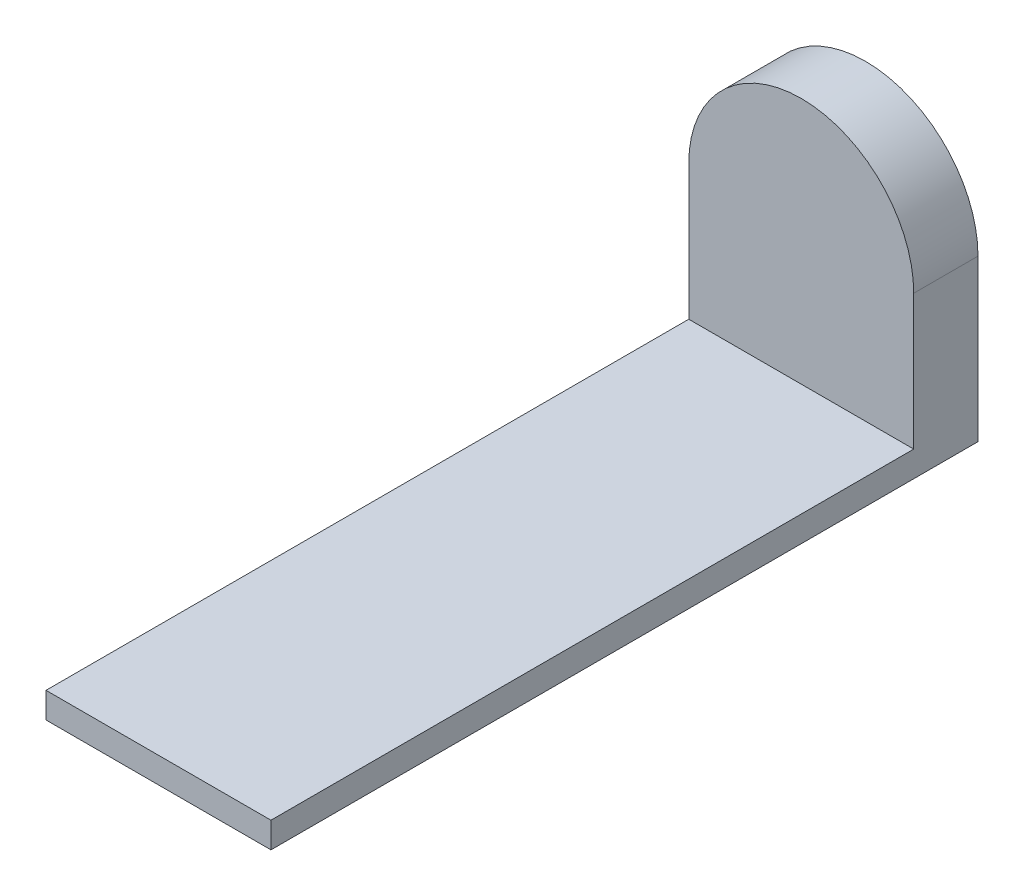
ISO-10303-21;
HEADER;
FILE_DESCRIPTION(('STEP AP214'),'2;1');
FILE_NAME('part.step','',(''),(''),'','','');
FILE_SCHEMA(('AUTOMOTIVE_DESIGN { 1 0 10303 214 1 1 1 1 }'));
ENDSEC;
DATA;
#1=APPLICATION_CONTEXT('core data for automotive mechanical design processes');
#2=APPLICATION_PROTOCOL_DEFINITION('international standard','automotive_design',2000,#1);
#3=PRODUCT_CONTEXT('',#1,'mechanical');
#4=PRODUCT('Part','Part','',(#3));
#5=PRODUCT_RELATED_PRODUCT_CATEGORY('part','',(#4));
#6=PRODUCT_DEFINITION_FORMATION('','',#4);
#7=PRODUCT_DEFINITION_CONTEXT('part definition',#1,'design');
#8=PRODUCT_DEFINITION('design','',#6,#7);
#9=PRODUCT_DEFINITION_SHAPE('','',#8);
#10=(LENGTH_UNIT() NAMED_UNIT(*) SI_UNIT(.MILLI.,.METRE.));
#11=(NAMED_UNIT(*) PLANE_ANGLE_UNIT() SI_UNIT($,.RADIAN.));
#12=(NAMED_UNIT(*) SI_UNIT($,.STERADIAN.) SOLID_ANGLE_UNIT());
#13=UNCERTAINTY_MEASURE_WITH_UNIT(LENGTH_MEASURE(1.E-05),#10,'distance_accuracy_value','');
#14=(GEOMETRIC_REPRESENTATION_CONTEXT(3) GLOBAL_UNCERTAINTY_ASSIGNED_CONTEXT((#13)) GLOBAL_UNIT_ASSIGNED_CONTEXT((#10,
#11,#12)) REPRESENTATION_CONTEXT('',''));
#15=CARTESIAN_POINT('',(0.,0.,0.));
#16=DIRECTION('',(0.,0.,1.));
#17=DIRECTION('',(1.,0.,0.));
#18=AXIS2_PLACEMENT_3D('',#15,#16,#17);
#19=CARTESIAN_POINT('',(0.,0.,10.));
#20=DIRECTION('',(0.,0.,-1.));
#21=DIRECTION('',(-1.,0.,0.));
#22=AXIS2_PLACEMENT_3D('',#19,#20,#21);
#23=CYLINDRICAL_SURFACE('',#22,17.5);
#24=CARTESIAN_POINT('',(0.,0.,0.));
#25=DIRECTION('',(0.,0.,1.));
#26=DIRECTION('',(1.,0.,0.));
#27=AXIS2_PLACEMENT_3D('',#24,#25,#26);
#28=CIRCLE('',#27,17.5);
#29=CARTESIAN_POINT('',(17.5,0.,0.));
#30=VERTEX_POINT('',#29);
#31=CARTESIAN_POINT('',(-17.5,0.,0.));
#32=VERTEX_POINT('',#31);
#33=EDGE_CURVE('E101',#30,#32,#28,.T.);
#34=ORIENTED_EDGE('',*,*,#33,.T.);
#35=DIRECTION('',(0.,0.,-1.));
#36=VECTOR('',#35,1.);
#37=CARTESIAN_POINT('',(-17.5,0.,10.));
#38=LINE('',#37,#36);
#39=CARTESIAN_POINT('',(-17.5,0.,10.));
#40=VERTEX_POINT('',#39);
#41=EDGE_CURVE('E11',#40,#32,#38,.T.);
#42=ORIENTED_EDGE('',*,*,#41,.F.);
#43=CARTESIAN_POINT('',(0.,0.,10.));
#44=DIRECTION('',(0.,0.,1.));
#45=DIRECTION('',(1.,0.,0.));
#46=AXIS2_PLACEMENT_3D('',#43,#44,#45);
#47=CIRCLE('',#46,17.5);
#48=CARTESIAN_POINT('',(17.5,0.,10.));
#49=VERTEX_POINT('',#48);
#50=EDGE_CURVE('E95',#49,#40,#47,.T.);
#51=ORIENTED_EDGE('',*,*,#50,.F.);
#52=DIRECTION('',(0.,0.,-1.));
#53=VECTOR('',#52,1.);
#54=CARTESIAN_POINT('',(17.5,0.,10.));
#55=LINE('',#54,#53);
#56=EDGE_CURVE('E86',#49,#30,#55,.T.);
#57=ORIENTED_EDGE('',*,*,#56,.T.);
#58=EDGE_LOOP('',(#34,#42,#51,#57));
#59=FACE_BOUND('',#58,.T.);
#60=ADVANCED_FACE('F43',(#59),#23,.T.);
#61=CARTESIAN_POINT('',(-17.5,0.,10.));
#62=DIRECTION('',(1.,0.,0.));
#63=DIRECTION('',(0.,1.,0.));
#64=AXIS2_PLACEMENT_3D('',#61,#62,#63);
#65=PLANE('',#64);
#66=DIRECTION('',(0.,-1.,0.));
#67=VECTOR('',#66,1.);
#68=CARTESIAN_POINT('',(-17.5,0.,0.));
#69=LINE('',#68,#67);
#70=CARTESIAN_POINT('',(-17.5,-25.,0.));
#71=VERTEX_POINT('',#70);
#72=EDGE_CURVE('E105',#32,#71,#69,.T.);
#73=ORIENTED_EDGE('',*,*,#72,.T.);
#74=DIRECTION('',(0.,0.,-1.));
#75=VECTOR('',#74,1.);
#76=CARTESIAN_POINT('',(-17.5,-25.,10.));
#77=LINE('',#76,#75);
#78=CARTESIAN_POINT('',(-17.5,-25.,110.));
#79=VERTEX_POINT('',#78);
#80=EDGE_CURVE('E51',#79,#71,#77,.T.);
#81=ORIENTED_EDGE('',*,*,#80,.F.);
#82=DIRECTION('',(0.,-1.,0.));
#83=VECTOR('',#82,1.);
#84=CARTESIAN_POINT('',(-17.5,-21.,110.));
#85=LINE('',#84,#83);
#86=CARTESIAN_POINT('',(-17.5,-21.,110.));
#87=VERTEX_POINT('',#86);
#88=EDGE_CURVE('E135',#87,#79,#85,.T.);
#89=ORIENTED_EDGE('',*,*,#88,.F.);
#90=DIRECTION('',(0.,0.,-1.));
#91=VECTOR('',#90,1.);
#92=CARTESIAN_POINT('',(-17.5,-21.,110.));
#93=LINE('',#92,#91);
#94=CARTESIAN_POINT('',(-17.5,-21.,10.));
#95=VERTEX_POINT('',#94);
#96=EDGE_CURVE('E113',#87,#95,#93,.T.);
#97=ORIENTED_EDGE('',*,*,#96,.T.);
#98=DIRECTION('',(0.,-1.,0.));
#99=VECTOR('',#98,1.);
#100=CARTESIAN_POINT('',(-17.5,0.,10.));
#101=LINE('',#100,#99);
#102=EDGE_CURVE('E161',#40,#95,#101,.T.);
#103=ORIENTED_EDGE('',*,*,#102,.F.);
#104=ORIENTED_EDGE('',*,*,#41,.T.);
#105=EDGE_LOOP('',(#73,#81,#89,#97,#103,#104));
#106=FACE_BOUND('',#105,.T.);
#107=ADVANCED_FACE('F133',(#106),#65,.F.);
#108=CARTESIAN_POINT('',(-17.5,-25.,10.));
#109=DIRECTION('',(0.,1.,0.));
#110=DIRECTION('',(0.,0.,1.));
#111=AXIS2_PLACEMENT_3D('',#108,#109,#110);
#112=PLANE('',#111);
#113=DIRECTION('',(1.,0.,0.));
#114=VECTOR('',#113,1.);
#115=CARTESIAN_POINT('',(-17.5,-25.,0.));
#116=LINE('',#115,#114);
#117=CARTESIAN_POINT('',(17.5,-25.,0.));
#118=VERTEX_POINT('',#117);
#119=EDGE_CURVE('E96',#71,#118,#116,.T.);
#120=ORIENTED_EDGE('',*,*,#119,.T.);
#121=DIRECTION('',(0.,0.,-1.));
#122=VECTOR('',#121,1.);
#123=CARTESIAN_POINT('',(17.5,-25.,10.));
#124=LINE('',#123,#122);
#125=CARTESIAN_POINT('',(17.5,-25.,110.));
#126=VERTEX_POINT('',#125);
#127=EDGE_CURVE('E90',#126,#118,#124,.T.);
#128=ORIENTED_EDGE('',*,*,#127,.F.);
#129=DIRECTION('',(1.,0.,0.));
#130=VECTOR('',#129,1.);
#131=CARTESIAN_POINT('',(-17.5,-25.,110.));
#132=LINE('',#131,#130);
#133=EDGE_CURVE('E129',#79,#126,#132,.T.);
#134=ORIENTED_EDGE('',*,*,#133,.F.);
#135=ORIENTED_EDGE('',*,*,#80,.T.);
#136=EDGE_LOOP('',(#120,#128,#134,#135));
#137=FACE_BOUND('',#136,.T.);
#138=ADVANCED_FACE('F126',(#137),#112,.F.);
#139=CARTESIAN_POINT('',(17.5,-25.,10.));
#140=DIRECTION('',(-1.,0.,0.));
#141=DIRECTION('',(0.,-1.,0.));
#142=AXIS2_PLACEMENT_3D('',#139,#140,#141);
#143=PLANE('',#142);
#144=DIRECTION('',(0.,1.,0.));
#145=VECTOR('',#144,1.);
#146=CARTESIAN_POINT('',(17.5,-25.,0.));
#147=LINE('',#146,#145);
#148=EDGE_CURVE('E83',#118,#30,#147,.T.);
#149=ORIENTED_EDGE('',*,*,#148,.T.);
#150=ORIENTED_EDGE('',*,*,#56,.F.);
#151=DIRECTION('',(0.,1.,0.));
#152=VECTOR('',#151,1.);
#153=CARTESIAN_POINT('',(17.5,-25.,10.));
#154=LINE('',#153,#152);
#155=CARTESIAN_POINT('',(17.5,-21.,10.));
#156=VERTEX_POINT('',#155);
#157=EDGE_CURVE('E63',#156,#49,#154,.T.);
#158=ORIENTED_EDGE('',*,*,#157,.F.);
#159=DIRECTION('',(0.,0.,-1.));
#160=VECTOR('',#159,1.);
#161=CARTESIAN_POINT('',(17.5,-21.,110.));
#162=LINE('',#161,#160);
#163=CARTESIAN_POINT('',(17.5,-21.,110.));
#164=VERTEX_POINT('',#163);
#165=EDGE_CURVE('E107',#164,#156,#162,.T.);
#166=ORIENTED_EDGE('',*,*,#165,.F.);
#167=DIRECTION('',(0.,1.,0.));
#168=VECTOR('',#167,1.);
#169=CARTESIAN_POINT('',(17.5,-21.,110.));
#170=LINE('',#169,#168);
#171=EDGE_CURVE('E150',#126,#164,#170,.T.);
#172=ORIENTED_EDGE('',*,*,#171,.F.);
#173=ORIENTED_EDGE('',*,*,#127,.T.);
#174=EDGE_LOOP('',(#149,#150,#158,#166,#172,#173));
#175=FACE_BOUND('',#174,.T.);
#176=ADVANCED_FACE('F85',(#175),#143,.F.);
#177=CARTESIAN_POINT('',(0.,0.,10.));
#178=DIRECTION('',(0.,0.,1.));
#179=DIRECTION('',(1.,0.,0.));
#180=AXIS2_PLACEMENT_3D('',#177,#178,#179);
#181=PLANE('',#180);
#182=DIRECTION('',(-1.,0.,0.));
#183=VECTOR('',#182,1.);
#184=CARTESIAN_POINT('',(-17.5,-21.,10.));
#185=LINE('',#184,#183);
#186=EDGE_CURVE('E58',#156,#95,#185,.T.);
#187=ORIENTED_EDGE('',*,*,#186,.F.);
#188=ORIENTED_EDGE('',*,*,#157,.T.);
#189=ORIENTED_EDGE('',*,*,#50,.T.);
#190=ORIENTED_EDGE('',*,*,#102,.T.);
#191=EDGE_LOOP('',(#187,#188,#189,#190));
#192=FACE_BOUND('',#191,.T.);
#193=ADVANCED_FACE('F164',(#192),#181,.T.);
#194=CARTESIAN_POINT('',(0.,0.,0.));
#195=DIRECTION('',(0.,0.,1.));
#196=DIRECTION('',(1.,0.,0.));
#197=AXIS2_PLACEMENT_3D('',#194,#195,#196);
#198=PLANE('',#197);
#199=ORIENTED_EDGE('',*,*,#33,.F.);
#200=ORIENTED_EDGE('',*,*,#148,.F.);
#201=ORIENTED_EDGE('',*,*,#119,.F.);
#202=ORIENTED_EDGE('',*,*,#72,.F.);
#203=EDGE_LOOP('',(#199,#200,#201,#202));
#204=FACE_BOUND('',#203,.T.);
#205=ADVANCED_FACE('F104',(#204),#198,.F.);
#206=CARTESIAN_POINT('',(-17.5,-21.,110.));
#207=DIRECTION('',(0.,-1.,0.));
#208=DIRECTION('',(0.,0.,-1.));
#209=AXIS2_PLACEMENT_3D('',#206,#207,#208);
#210=PLANE('',#209);
#211=ORIENTED_EDGE('',*,*,#186,.T.);
#212=ORIENTED_EDGE('',*,*,#96,.F.);
#213=DIRECTION('',(-1.,0.,0.));
#214=VECTOR('',#213,1.);
#215=CARTESIAN_POINT('',(-17.5,-21.,110.));
#216=LINE('',#215,#214);
#217=EDGE_CURVE('E147',#164,#87,#216,.T.);
#218=ORIENTED_EDGE('',*,*,#217,.F.);
#219=ORIENTED_EDGE('',*,*,#165,.T.);
#220=EDGE_LOOP('',(#211,#212,#218,#219));
#221=FACE_BOUND('',#220,.T.);
#222=ADVANCED_FACE('F155',(#221),#210,.F.);
#223=CARTESIAN_POINT('',(0.,0.,110.));
#224=DIRECTION('',(0.,0.,1.));
#225=DIRECTION('',(1.,0.,0.));
#226=AXIS2_PLACEMENT_3D('',#223,#224,#225);
#227=PLANE('',#226);
#228=ORIENTED_EDGE('',*,*,#88,.T.);
#229=ORIENTED_EDGE('',*,*,#133,.T.);
#230=ORIENTED_EDGE('',*,*,#171,.T.);
#231=ORIENTED_EDGE('',*,*,#217,.T.);
#232=EDGE_LOOP('',(#228,#229,#230,#231));
#233=FACE_BOUND('',#232,.T.);
#234=ADVANCED_FACE('F149',(#233),#227,.T.);
#235=CLOSED_SHELL('',(#60,#107,#138,#176,#193,#205,#222,#234));
#236=MANIFOLD_SOLID_BREP('B2',#235);
#237=ADVANCED_BREP_SHAPE_REPRESENTATION('',(#18,#236),#14);
#238=SHAPE_DEFINITION_REPRESENTATION(#9,#237);
ENDSEC;
END-ISO-10303-21;
